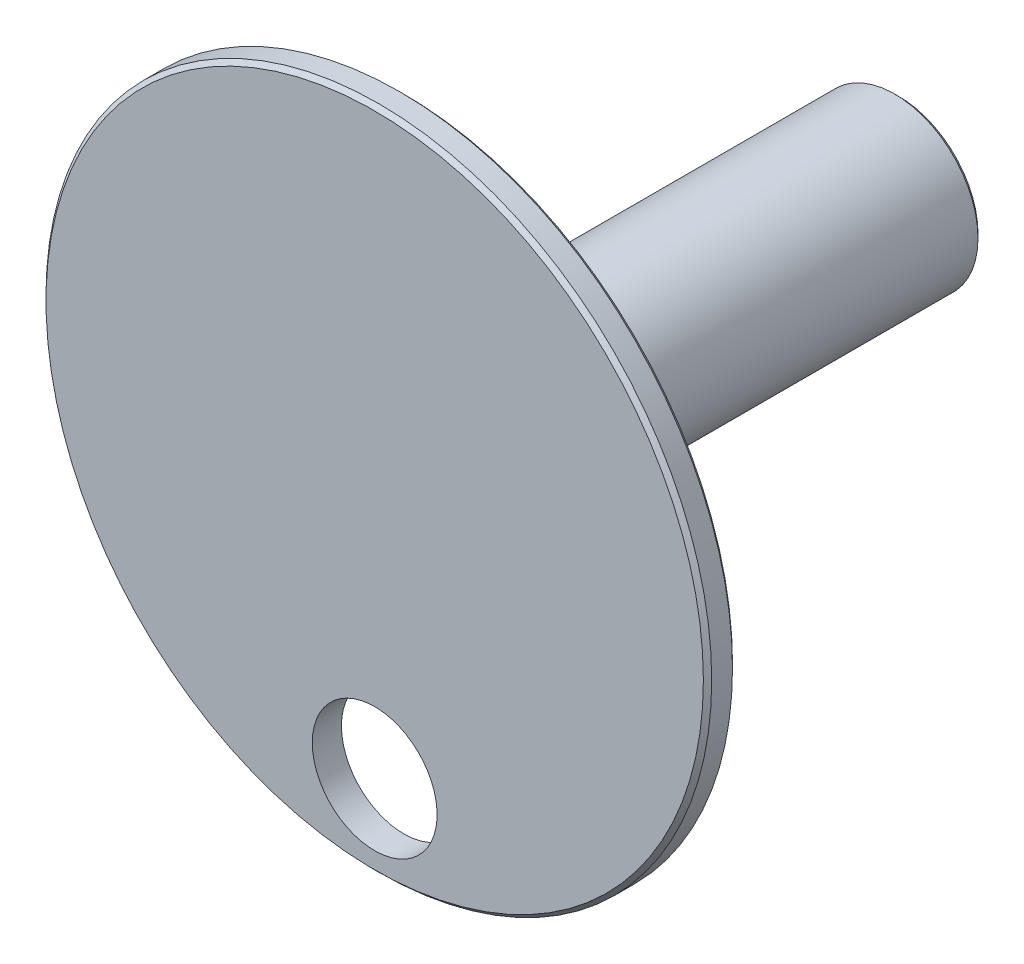
ISO-10303-21;
HEADER;
FILE_DESCRIPTION(('STEP AP214'),'2;1');
FILE_NAME('part.step','',(''),(''),'','','');
FILE_SCHEMA(('AUTOMOTIVE_DESIGN { 1 0 10303 214 1 1 1 1 }'));
ENDSEC;
DATA;
#1=APPLICATION_CONTEXT('core data for automotive mechanical design processes');
#2=APPLICATION_PROTOCOL_DEFINITION('international standard','automotive_design',2000,#1);
#3=PRODUCT_CONTEXT('',#1,'mechanical');
#4=PRODUCT('Part','Part','',(#3));
#5=PRODUCT_RELATED_PRODUCT_CATEGORY('part','',(#4));
#6=PRODUCT_DEFINITION_FORMATION('','',#4);
#7=PRODUCT_DEFINITION_CONTEXT('part definition',#1,'design');
#8=PRODUCT_DEFINITION('design','',#6,#7);
#9=PRODUCT_DEFINITION_SHAPE('','',#8);
#10=(LENGTH_UNIT() NAMED_UNIT(*) SI_UNIT(.MILLI.,.METRE.));
#11=(NAMED_UNIT(*) PLANE_ANGLE_UNIT() SI_UNIT($,.RADIAN.));
#12=(NAMED_UNIT(*) SI_UNIT($,.STERADIAN.) SOLID_ANGLE_UNIT());
#13=UNCERTAINTY_MEASURE_WITH_UNIT(LENGTH_MEASURE(1.E-05),#10,'distance_accuracy_value','');
#14=(GEOMETRIC_REPRESENTATION_CONTEXT(3) GLOBAL_UNCERTAINTY_ASSIGNED_CONTEXT((#13)) GLOBAL_UNIT_ASSIGNED_CONTEXT((#10,
#11,#12)) REPRESENTATION_CONTEXT('',''));
#15=CARTESIAN_POINT('',(0.,0.,0.));
#16=DIRECTION('',(0.,0.,1.));
#17=DIRECTION('',(1.,0.,0.));
#18=AXIS2_PLACEMENT_3D('',#15,#16,#17);
#19=CARTESIAN_POINT('',(0.,0.,11.6));
#20=DIRECTION('',(0.,0.,-1.));
#21=DIRECTION('',(-1.,0.,0.));
#22=AXIS2_PLACEMENT_3D('',#19,#20,#21);
#23=CYLINDRICAL_SURFACE('',#22,2.);
#24=CARTESIAN_POINT('',(0.,0.,0.0999999999999959));
#25=DIRECTION('',(0.,0.,1.));
#26=DIRECTION('',(1.,0.,0.));
#27=AXIS2_PLACEMENT_3D('',#24,#25,#26);
#28=CIRCLE('',#27,2.);
#29=CARTESIAN_POINT('',(2.,0.,0.0999999999999959));
#30=VERTEX_POINT('',#29);
#31=EDGE_CURVE('E57',#30,#30,#28,.T.);
#32=ORIENTED_EDGE('',*,*,#31,.T.);
#33=EDGE_LOOP('',(#32));
#34=FACE_BOUND('',#33,.T.);
#35=CARTESIAN_POINT('',(0.,0.,11.6));
#36=DIRECTION('',(0.,0.,1.));
#37=DIRECTION('',(1.,0.,0.));
#38=AXIS2_PLACEMENT_3D('',#35,#36,#37);
#39=CIRCLE('',#38,2.);
#40=CARTESIAN_POINT('',(2.,0.,11.6));
#41=VERTEX_POINT('',#40);
#42=EDGE_CURVE('E60',#41,#41,#39,.T.);
#43=ORIENTED_EDGE('',*,*,#42,.F.);
#44=EDGE_LOOP('',(#43));
#45=FACE_BOUND('',#44,.T.);
#46=ADVANCED_FACE('F33',(#34,#45),#23,.T.);
#47=CARTESIAN_POINT('',(0.,0.,0.));
#48=DIRECTION('',(0.,0.,1.));
#49=DIRECTION('',(1.,0.,0.));
#50=AXIS2_PLACEMENT_3D('',#47,#48,#49);
#51=PLANE('',#50);
#52=CARTESIAN_POINT('',(0.,0.,0.));
#53=DIRECTION('',(0.,0.,1.));
#54=DIRECTION('',(1.,0.,0.));
#55=AXIS2_PLACEMENT_3D('',#52,#53,#54);
#56=CIRCLE('',#55,1.9);
#57=CARTESIAN_POINT('',(1.9,0.,0.));
#58=VERTEX_POINT('',#57);
#59=EDGE_CURVE('E54',#58,#58,#56,.F.);
#60=ORIENTED_EDGE('',*,*,#59,.T.);
#61=EDGE_LOOP('',(#60));
#62=FACE_BOUND('',#61,.T.);
#63=CARTESIAN_POINT('',(0.,0.,0.));
#64=DIRECTION('',(0.,0.,-1.));
#65=DIRECTION('',(-1.,0.,0.));
#66=AXIS2_PLACEMENT_3D('',#63,#64,#65);
#67=CIRCLE('',#66,1.5);
#68=CARTESIAN_POINT('',(-1.5,0.,0.));
#69=VERTEX_POINT('',#68);
#70=EDGE_CURVE('E70',#69,#69,#67,.T.);
#71=ORIENTED_EDGE('',*,*,#70,.F.);
#72=EDGE_LOOP('',(#71));
#73=FACE_BOUND('',#72,.T.);
#74=ADVANCED_FACE('F103',(#62,#73),#51,.F.);
#75=CARTESIAN_POINT('',(0.,0.,11.9));
#76=DIRECTION('',(0.,0.,-1.));
#77=DIRECTION('',(-1.,0.,0.));
#78=AXIS2_PLACEMENT_3D('',#75,#76,#77);
#79=CYLINDRICAL_SURFACE('',#78,4.);
#80=CARTESIAN_POINT('',(0.,0.,11.9));
#81=DIRECTION('',(0.,0.,1.));
#82=DIRECTION('',(1.,0.,0.));
#83=AXIS2_PLACEMENT_3D('',#80,#81,#82);
#84=CIRCLE('',#83,4.);
#85=CARTESIAN_POINT('',(4.,0.,11.9));
#86=VERTEX_POINT('',#85);
#87=EDGE_CURVE('E63',#86,#86,#84,.T.);
#88=ORIENTED_EDGE('',*,*,#87,.F.);
#89=EDGE_LOOP('',(#88));
#90=FACE_BOUND('',#89,.T.);
#91=CARTESIAN_POINT('',(0.,0.,11.6));
#92=DIRECTION('',(0.,0.,1.));
#93=DIRECTION('',(1.,0.,0.));
#94=AXIS2_PLACEMENT_3D('',#91,#92,#93);
#95=CIRCLE('',#94,4.);
#96=CARTESIAN_POINT('',(4.,0.,11.6));
#97=VERTEX_POINT('',#96);
#98=EDGE_CURVE('E64',#97,#97,#95,.T.);
#99=ORIENTED_EDGE('',*,*,#98,.T.);
#100=EDGE_LOOP('',(#99));
#101=FACE_BOUND('',#100,.T.);
#102=ADVANCED_FACE('F99',(#90,#101),#79,.T.);
#103=CARTESIAN_POINT('',(0.,0.,11.6));
#104=DIRECTION('',(0.,0.,1.));
#105=DIRECTION('',(1.,0.,0.));
#106=AXIS2_PLACEMENT_3D('',#103,#104,#105);
#107=PLANE('',#106);
#108=ORIENTED_EDGE('',*,*,#42,.T.);
#109=EDGE_LOOP('',(#108));
#110=FACE_BOUND('',#109,.T.);
#111=ORIENTED_EDGE('',*,*,#98,.F.);
#112=EDGE_LOOP('',(#111));
#113=FACE_BOUND('',#112,.T.);
#114=ADVANCED_FACE('F102',(#110,#113),#107,.F.);
#115=CARTESIAN_POINT('',(0.,0.,12.6));
#116=DIRECTION('',(0.,0.,-1.));
#117=DIRECTION('',(-1.,0.,0.));
#118=AXIS2_PLACEMENT_3D('',#115,#116,#117);
#119=CYLINDRICAL_SURFACE('',#118,8.);
#120=CARTESIAN_POINT('',(0.,0.,12.));
#121=DIRECTION('',(0.,0.,1.));
#122=DIRECTION('',(1.,0.,0.));
#123=AXIS2_PLACEMENT_3D('',#120,#121,#122);
#124=CIRCLE('',#123,8.);
#125=CARTESIAN_POINT('',(8.,0.,12.));
#126=VERTEX_POINT('',#125);
#127=EDGE_CURVE('E45',#126,#126,#124,.T.);
#128=ORIENTED_EDGE('',*,*,#127,.T.);
#129=EDGE_LOOP('',(#128));
#130=FACE_BOUND('',#129,.T.);
#131=CARTESIAN_POINT('',(0.,0.,12.5));
#132=DIRECTION('',(0.,0.,1.));
#133=DIRECTION('',(1.,0.,0.));
#134=AXIS2_PLACEMENT_3D('',#131,#132,#133);
#135=CIRCLE('',#134,8.);
#136=CARTESIAN_POINT('',(8.,0.,12.5));
#137=VERTEX_POINT('',#136);
#138=EDGE_CURVE('E49',#137,#137,#135,.F.);
#139=ORIENTED_EDGE('',*,*,#138,.T.);
#140=EDGE_LOOP('',(#139));
#141=FACE_BOUND('',#140,.T.);
#142=ADVANCED_FACE('F108',(#130,#141),#119,.T.);
#143=CARTESIAN_POINT('',(0.,0.,12.6));
#144=DIRECTION('',(0.,0.,1.));
#145=DIRECTION('',(1.,0.,0.));
#146=AXIS2_PLACEMENT_3D('',#143,#144,#145);
#147=PLANE('',#146);
#148=CARTESIAN_POINT('',(0.,0.,12.6));
#149=DIRECTION('',(0.,0.,1.));
#150=DIRECTION('',(1.,0.,0.));
#151=AXIS2_PLACEMENT_3D('',#148,#149,#150);
#152=CIRCLE('',#151,7.9);
#153=CARTESIAN_POINT('',(7.9,0.,12.6));
#154=VERTEX_POINT('',#153);
#155=EDGE_CURVE('E10',#154,#154,#152,.T.);
#156=ORIENTED_EDGE('',*,*,#155,.T.);
#157=EDGE_LOOP('',(#156));
#158=FACE_BOUND('',#157,.T.);
#159=CARTESIAN_POINT('',(0.,-6.,12.6));
#160=DIRECTION('',(0.,0.,-1.));
#161=DIRECTION('',(-1.,0.,0.));
#162=AXIS2_PLACEMENT_3D('',#159,#160,#161);
#163=CIRCLE('',#162,1.5);
#164=CARTESIAN_POINT('',(-1.5,-6.,12.6));
#165=VERTEX_POINT('',#164);
#166=EDGE_CURVE('E73',#165,#165,#163,.T.);
#167=ORIENTED_EDGE('',*,*,#166,.T.);
#168=EDGE_LOOP('',(#167));
#169=FACE_BOUND('',#168,.T.);
#170=ADVANCED_FACE('F82',(#158,#169),#147,.T.);
#171=CARTESIAN_POINT('',(0.,0.,11.9));
#172=DIRECTION('',(0.,0.,1.));
#173=DIRECTION('',(1.,0.,0.));
#174=AXIS2_PLACEMENT_3D('',#171,#172,#173);
#175=PLANE('',#174);
#176=CARTESIAN_POINT('',(0.,0.,11.9));
#177=DIRECTION('',(0.,0.,1.));
#178=DIRECTION('',(1.,0.,0.));
#179=AXIS2_PLACEMENT_3D('',#176,#177,#178);
#180=CIRCLE('',#179,7.90000000000001);
#181=CARTESIAN_POINT('',(7.90000000000001,0.,11.9));
#182=VERTEX_POINT('',#181);
#183=EDGE_CURVE('E41',#182,#182,#180,.F.);
#184=ORIENTED_EDGE('',*,*,#183,.T.);
#185=EDGE_LOOP('',(#184));
#186=FACE_BOUND('',#185,.T.);
#187=CARTESIAN_POINT('',(0.,-6.,11.9));
#188=DIRECTION('',(0.,0.,-1.));
#189=DIRECTION('',(-1.,0.,0.));
#190=AXIS2_PLACEMENT_3D('',#187,#188,#189);
#191=CIRCLE('',#190,1.5);
#192=CARTESIAN_POINT('',(-1.5,-6.,11.9));
#193=VERTEX_POINT('',#192);
#194=EDGE_CURVE('E76',#193,#193,#191,.T.);
#195=ORIENTED_EDGE('',*,*,#194,.F.);
#196=EDGE_LOOP('',(#195));
#197=FACE_BOUND('',#196,.T.);
#198=ORIENTED_EDGE('',*,*,#87,.T.);
#199=EDGE_LOOP('',(#198));
#200=FACE_BOUND('',#199,.T.);
#201=ADVANCED_FACE('F92',(#186,#197,#200),#175,.F.);
#202=CARTESIAN_POINT('',(0.,0.,8.5));
#203=DIRECTION('',(0.,0.,-1.));
#204=DIRECTION('',(-1.,0.,0.));
#205=AXIS2_PLACEMENT_3D('',#202,#203,#204);
#206=CYLINDRICAL_SURFACE('',#205,1.5);
#207=CARTESIAN_POINT('',(0.,0.,8.5));
#208=DIRECTION('',(0.,0.,-1.));
#209=DIRECTION('',(-1.,0.,0.));
#210=AXIS2_PLACEMENT_3D('',#207,#208,#209);
#211=CIRCLE('',#210,1.5);
#212=CARTESIAN_POINT('',(-1.5,0.,8.5));
#213=VERTEX_POINT('',#212);
#214=EDGE_CURVE('E67',#213,#213,#211,.T.);
#215=ORIENTED_EDGE('',*,*,#214,.F.);
#216=EDGE_LOOP('',(#215));
#217=FACE_BOUND('',#216,.T.);
#218=ORIENTED_EDGE('',*,*,#70,.T.);
#219=EDGE_LOOP('',(#218));
#220=FACE_BOUND('',#219,.T.);
#221=ADVANCED_FACE('F95',(#217,#220),#206,.F.);
#222=CARTESIAN_POINT('',(0.,0.,8.5));
#223=DIRECTION('',(0.,0.,-1.));
#224=DIRECTION('',(-1.,0.,0.));
#225=AXIS2_PLACEMENT_3D('',#222,#223,#224);
#226=PLANE('',#225);
#227=ORIENTED_EDGE('',*,*,#214,.T.);
#228=EDGE_LOOP('',(#227));
#229=FACE_BOUND('',#228,.T.);
#230=ADVANCED_FACE('F88',(#229),#226,.T.);
#231=CARTESIAN_POINT('',(0.,-6.,12.6));
#232=DIRECTION('',(0.,0.,-1.));
#233=DIRECTION('',(-1.,0.,0.));
#234=AXIS2_PLACEMENT_3D('',#231,#232,#233);
#235=CYLINDRICAL_SURFACE('',#234,1.5);
#236=CARTESIAN_POINT('',(-1.5,-6.,12.6));
#237=CARTESIAN_POINT('',(-1.5,-6.,12.5927083333333));
#238=CARTESIAN_POINT('',(-1.5,-6.,12.5854166666667));
#239=CARTESIAN_POINT('',(-1.5,-6.,12.5708333333333));
#240=CARTESIAN_POINT('',(-1.5,-6.,12.5635416666667));
#241=CARTESIAN_POINT('',(-1.5,-6.,12.5489583333333));
#242=CARTESIAN_POINT('',(-1.5,-6.,12.5416666666667));
#243=CARTESIAN_POINT('',(-1.5,-6.,12.5270833333333));
#244=CARTESIAN_POINT('',(-1.5,-6.,12.5197916666667));
#245=CARTESIAN_POINT('',(-1.5,-6.,12.5052083333333));
#246=CARTESIAN_POINT('',(-1.5,-6.,12.4979166666667));
#247=CARTESIAN_POINT('',(-1.5,-6.,12.4833333333333));
#248=CARTESIAN_POINT('',(-1.5,-6.,12.4760416666667));
#249=CARTESIAN_POINT('',(-1.5,-6.,12.4614583333333));
#250=CARTESIAN_POINT('',(-1.5,-6.,12.4541666666667));
#251=CARTESIAN_POINT('',(-1.5,-6.,12.4395833333333));
#252=CARTESIAN_POINT('',(-1.5,-6.,12.4322916666667));
#253=CARTESIAN_POINT('',(-1.5,-6.,12.4177083333333));
#254=CARTESIAN_POINT('',(-1.5,-6.,12.4104166666667));
#255=CARTESIAN_POINT('',(-1.5,-6.,12.3958333333333));
#256=CARTESIAN_POINT('',(-1.5,-6.,12.3885416666667));
#257=CARTESIAN_POINT('',(-1.5,-6.,12.3739583333333));
#258=CARTESIAN_POINT('',(-1.5,-6.,12.3666666666667));
#259=CARTESIAN_POINT('',(-1.5,-6.,12.3520833333333));
#260=CARTESIAN_POINT('',(-1.5,-6.,12.3447916666667));
#261=CARTESIAN_POINT('',(-1.5,-6.,12.3302083333333));
#262=CARTESIAN_POINT('',(-1.5,-6.,12.3229166666667));
#263=CARTESIAN_POINT('',(-1.5,-6.,12.3083333333333));
#264=CARTESIAN_POINT('',(-1.5,-6.,12.3010416666667));
#265=CARTESIAN_POINT('',(-1.5,-6.,12.2864583333333));
#266=CARTESIAN_POINT('',(-1.5,-6.,12.2791666666667));
#267=CARTESIAN_POINT('',(-1.5,-6.,12.2645833333333));
#268=CARTESIAN_POINT('',(-1.5,-6.,12.2572916666667));
#269=CARTESIAN_POINT('',(-1.5,-6.,12.2427083333333));
#270=CARTESIAN_POINT('',(-1.5,-6.,12.2354166666667));
#271=CARTESIAN_POINT('',(-1.5,-6.,12.2208333333333));
#272=CARTESIAN_POINT('',(-1.5,-6.,12.2135416666667));
#273=CARTESIAN_POINT('',(-1.5,-6.,12.1989583333333));
#274=CARTESIAN_POINT('',(-1.5,-6.,12.1916666666667));
#275=CARTESIAN_POINT('',(-1.5,-6.,12.1770833333333));
#276=CARTESIAN_POINT('',(-1.5,-6.,12.1697916666667));
#277=CARTESIAN_POINT('',(-1.5,-6.,12.1552083333333));
#278=CARTESIAN_POINT('',(-1.5,-6.,12.1479166666667));
#279=CARTESIAN_POINT('',(-1.5,-6.,12.1333333333333));
#280=CARTESIAN_POINT('',(-1.5,-6.,12.1260416666667));
#281=CARTESIAN_POINT('',(-1.5,-6.,12.1114583333333));
#282=CARTESIAN_POINT('',(-1.5,-6.,12.1041666666667));
#283=CARTESIAN_POINT('',(-1.5,-6.,12.0895833333333));
#284=CARTESIAN_POINT('',(-1.5,-6.,12.0822916666667));
#285=CARTESIAN_POINT('',(-1.5,-6.,12.0677083333333));
#286=CARTESIAN_POINT('',(-1.5,-6.,12.0604166666667));
#287=CARTESIAN_POINT('',(-1.5,-6.,12.0458333333333));
#288=CARTESIAN_POINT('',(-1.5,-6.,12.0385416666667));
#289=CARTESIAN_POINT('',(-1.5,-6.,12.0239583333333));
#290=CARTESIAN_POINT('',(-1.5,-6.,12.0166666666667));
#291=CARTESIAN_POINT('',(-1.5,-6.,12.0020833333333));
#292=CARTESIAN_POINT('',(-1.5,-6.,11.9947916666667));
#293=CARTESIAN_POINT('',(-1.5,-6.,11.9802083333333));
#294=CARTESIAN_POINT('',(-1.5,-6.,11.9729166666667));
#295=CARTESIAN_POINT('',(-1.5,-6.,11.9583333333333));
#296=CARTESIAN_POINT('',(-1.5,-6.,11.9510416666667));
#297=CARTESIAN_POINT('',(-1.5,-6.,11.9364583333333));
#298=CARTESIAN_POINT('',(-1.5,-6.,11.9291666666667));
#299=CARTESIAN_POINT('',(-1.5,-6.,11.9145833333333));
#300=CARTESIAN_POINT('',(-1.5,-6.,11.9072916666667));
#301=CARTESIAN_POINT('',(-1.5,-6.,11.9));
#302=B_SPLINE_CURVE_WITH_KNOTS('',3,(#236,#237,#238,#239,#240,#241,#242,#243,#244,#245,#246,
#247,#248,#249,#250,#251,#252,#253,#254,#255,#256,#257,#258,#259,#260,#261,#262,#263,#264,#265,
#266,#267,#268,#269,#270,#271,#272,#273,#274,#275,#276,#277,#278,#279,#280,#281,#282,#283,#284,
#285,#286,#287,#288,#289,#290,#291,#292,#293,#294,#295,#296,#297,#298,#299,#300,#301),
.UNSPECIFIED.,.F.,.F.,(4,2,2,2,2,2,2,2,2,2,2,2,2,2,2,2,2,2,2,2,2,2,2,2,2,2,2,2,2,2,2,2,4),(0.,
0.0218750000000011,0.0437500000000004,0.0656250000000014,0.0875000000000008,0.109375,
0.131250000000001,0.153125,0.175000000000002,0.196875000000001,0.21875,0.240625000000001,
0.262500000000001,0.284375,0.306250000000001,0.328125,0.350000000000001,0.371875000000001,
0.39375,0.415625000000001,0.4375,0.459375,0.481250000000001,0.503125,0.525000000000001,0.546875,
0.56875,0.590625000000001,0.6125,0.634374999999999,0.656250000000001,0.678125,
0.700000000000001),.UNSPECIFIED.);
#303=EDGE_CURVE('BSEAM84',#165,#193,#302,.T.);
#304=ORIENTED_EDGE('',*,*,#166,.F.);
#305=ORIENTED_EDGE('',*,*,#194,.T.);
#306=ORIENTED_EDGE('',*,*,#303,.T.);
#307=ORIENTED_EDGE('',*,*,#303,.F.);
#308=EDGE_LOOP('',(#304,#306,#305,#307));
#309=FACE_BOUND('',#308,.T.);
#310=ADVANCED_FACE('F84',(#309),#235,.F.);
#311=CARTESIAN_POINT('',(0.,0.,0.0999999999999959));
#312=DIRECTION('',(0.,0.,1.));
#313=DIRECTION('',(1.,0.,0.));
#314=AXIS2_PLACEMENT_3D('',#311,#312,#313);
#315=CONICAL_SURFACE('',#314,2.,0.785398163397466);
#316=ORIENTED_EDGE('',*,*,#59,.F.);
#317=EDGE_LOOP('',(#316));
#318=FACE_BOUND('',#317,.T.);
#319=ORIENTED_EDGE('',*,*,#31,.F.);
#320=EDGE_LOOP('',(#319));
#321=FACE_BOUND('',#320,.T.);
#322=ADVANCED_FACE('F87',(#318,#321),#315,.T.);
#323=CARTESIAN_POINT('',(0.,0.,12.));
#324=DIRECTION('',(0.,0.,1.));
#325=DIRECTION('',(1.,0.,0.));
#326=AXIS2_PLACEMENT_3D('',#323,#324,#325);
#327=CONICAL_SURFACE('',#326,8.,0.78539816339744);
#328=CARTESIAN_POINT('',(7.90000000000001,0.,11.9));
#329=CARTESIAN_POINT('',(7.90104166666667,0.,11.9010416666667));
#330=CARTESIAN_POINT('',(7.90208333333334,0.,11.9020833333333));
#331=CARTESIAN_POINT('',(7.90416666666667,0.,11.9041666666667));
#332=CARTESIAN_POINT('',(7.90520833333334,0.,11.9052083333333));
#333=CARTESIAN_POINT('',(7.90729166666667,0.,11.9072916666667));
#334=CARTESIAN_POINT('',(7.90833333333334,0.,11.9083333333333));
#335=CARTESIAN_POINT('',(7.91041666666667,0.,11.9104166666667));
#336=CARTESIAN_POINT('',(7.91145833333334,0.,11.9114583333333));
#337=CARTESIAN_POINT('',(7.91354166666667,0.,11.9135416666667));
#338=CARTESIAN_POINT('',(7.91458333333334,0.,11.9145833333333));
#339=CARTESIAN_POINT('',(7.91666666666667,0.,11.9166666666667));
#340=CARTESIAN_POINT('',(7.91770833333334,0.,11.9177083333333));
#341=CARTESIAN_POINT('',(7.91979166666667,0.,11.9197916666667));
#342=CARTESIAN_POINT('',(7.92083333333334,0.,11.9208333333333));
#343=CARTESIAN_POINT('',(7.92291666666667,0.,11.9229166666667));
#344=CARTESIAN_POINT('',(7.92395833333334,0.,11.9239583333333));
#345=CARTESIAN_POINT('',(7.92604166666667,0.,11.9260416666667));
#346=CARTESIAN_POINT('',(7.92708333333334,0.,11.9270833333333));
#347=CARTESIAN_POINT('',(7.92916666666667,0.,11.9291666666667));
#348=CARTESIAN_POINT('',(7.93020833333334,0.,11.9302083333333));
#349=CARTESIAN_POINT('',(7.93229166666667,0.,11.9322916666667));
#350=CARTESIAN_POINT('',(7.93333333333334,0.,11.9333333333333));
#351=CARTESIAN_POINT('',(7.93541666666667,0.,11.9354166666667));
#352=CARTESIAN_POINT('',(7.93645833333334,0.,11.9364583333333));
#353=CARTESIAN_POINT('',(7.93854166666667,0.,11.9385416666667));
#354=CARTESIAN_POINT('',(7.93958333333334,0.,11.9395833333333));
#355=CARTESIAN_POINT('',(7.94166666666667,0.,11.9416666666667));
#356=CARTESIAN_POINT('',(7.94270833333334,0.,11.9427083333333));
#357=CARTESIAN_POINT('',(7.94479166666667,0.,11.9447916666667));
#358=CARTESIAN_POINT('',(7.94583333333334,0.,11.9458333333333));
#359=CARTESIAN_POINT('',(7.94791666666667,0.,11.9479166666667));
#360=CARTESIAN_POINT('',(7.94895833333334,0.,11.9489583333333));
#361=CARTESIAN_POINT('',(7.95104166666667,0.,11.9510416666667));
#362=CARTESIAN_POINT('',(7.95208333333334,0.,11.9520833333333));
#363=CARTESIAN_POINT('',(7.95416666666667,0.,11.9541666666667));
#364=CARTESIAN_POINT('',(7.95520833333334,0.,11.9552083333333));
#365=CARTESIAN_POINT('',(7.95729166666667,0.,11.9572916666667));
#366=CARTESIAN_POINT('',(7.95833333333334,0.,11.9583333333333));
#367=CARTESIAN_POINT('',(7.96041666666667,0.,11.9604166666667));
#368=CARTESIAN_POINT('',(7.96145833333334,0.,11.9614583333333));
#369=CARTESIAN_POINT('',(7.96354166666667,0.,11.9635416666667));
#370=CARTESIAN_POINT('',(7.96458333333334,0.,11.9645833333333));
#371=CARTESIAN_POINT('',(7.96666666666667,0.,11.9666666666667));
#372=CARTESIAN_POINT('',(7.96770833333334,0.,11.9677083333333));
#373=CARTESIAN_POINT('',(7.96979166666667,0.,11.9697916666667));
#374=CARTESIAN_POINT('',(7.97083333333333,0.,11.9708333333333));
#375=CARTESIAN_POINT('',(7.97291666666667,0.,11.9729166666667));
#376=CARTESIAN_POINT('',(7.97395833333333,0.,11.9739583333333));
#377=CARTESIAN_POINT('',(7.97604166666667,0.,11.9760416666667));
#378=CARTESIAN_POINT('',(7.97708333333333,0.,11.9770833333333));
#379=CARTESIAN_POINT('',(7.97916666666667,0.,11.9791666666667));
#380=CARTESIAN_POINT('',(7.98020833333333,0.,11.9802083333333));
#381=CARTESIAN_POINT('',(7.98229166666667,0.,11.9822916666667));
#382=CARTESIAN_POINT('',(7.98333333333333,0.,11.9833333333333));
#383=CARTESIAN_POINT('',(7.98541666666667,0.,11.9854166666667));
#384=CARTESIAN_POINT('',(7.98645833333333,0.,11.9864583333333));
#385=CARTESIAN_POINT('',(7.98854166666667,0.,11.9885416666667));
#386=CARTESIAN_POINT('',(7.98958333333333,0.,11.9895833333333));
#387=CARTESIAN_POINT('',(7.99166666666667,0.,11.9916666666667));
#388=CARTESIAN_POINT('',(7.99270833333333,0.,11.9927083333333));
#389=CARTESIAN_POINT('',(7.99479166666667,0.,11.9947916666667));
#390=CARTESIAN_POINT('',(7.99583333333333,0.,11.9958333333333));
#391=CARTESIAN_POINT('',(7.99791666666667,0.,11.9979166666667));
#392=CARTESIAN_POINT('',(7.99895833333333,0.,11.9989583333333));
#393=CARTESIAN_POINT('',(8.,0.,12.));
#394=B_SPLINE_CURVE_WITH_KNOTS('',3,(#328,#329,#330,#331,#332,#333,#334,#335,#336,#337,#338,
#339,#340,#341,#342,#343,#344,#345,#346,#347,#348,#349,#350,#351,#352,#353,#354,#355,#356,#357,
#358,#359,#360,#361,#362,#363,#364,#365,#366,#367,#368,#369,#370,#371,#372,#373,#374,#375,#376,
#377,#378,#379,#380,#381,#382,#383,#384,#385,#386,#387,#388,#389,#390,#391,#392,#393),
.UNSPECIFIED.,.F.,.F.,(4,2,2,2,2,2,2,2,2,2,2,2,2,2,2,2,2,2,2,2,2,2,2,2,2,2,2,2,2,2,2,2,4),(0.,
0.00441941738241544,0.00883883476483087,0.0132582521472463,0.0176776695296617,
0.0220970869120772,0.0265165042944926,0.030935921676908,0.0353553390593235,0.0397747564417389,
0.0441941738241543,0.048613591206571,0.0530330085889864,0.0574524259714019,0.0618718433538173,
0.0662912607362327,0.0707106781186482,0.0751300955010648,0.0795495128834803,0.0839689302658957,
0.0883883476483112,0.0928077650307266,0.0972271824131433,0.101646599795559,0.106066017177974,
0.11048543456039,0.114904851942805,0.11932426932522,0.123743686707636,0.128163104090051,
0.132582521472467,0.137001938854882,0.1414213562373),.UNSPECIFIED.);
#395=EDGE_CURVE('BSEAM131',#182,#126,#394,.T.);
#396=ORIENTED_EDGE('',*,*,#183,.F.);
#397=ORIENTED_EDGE('',*,*,#127,.F.);
#398=ORIENTED_EDGE('',*,*,#395,.T.);
#399=ORIENTED_EDGE('',*,*,#395,.F.);
#400=EDGE_LOOP('',(#396,#398,#397,#399));
#401=FACE_BOUND('',#400,.T.);
#402=ADVANCED_FACE('F131',(#401),#327,.T.);
#403=CARTESIAN_POINT('',(0.,0.,12.6));
#404=DIRECTION('',(0.,0.,-1.));
#405=DIRECTION('',(-1.,0.,0.));
#406=AXIS2_PLACEMENT_3D('',#403,#404,#405);
#407=CONICAL_SURFACE('',#406,7.9,0.78539816339744);
#408=ORIENTED_EDGE('',*,*,#138,.F.);
#409=EDGE_LOOP('',(#408));
#410=FACE_BOUND('',#409,.T.);
#411=ORIENTED_EDGE('',*,*,#155,.F.);
#412=EDGE_LOOP('',(#411));
#413=FACE_BOUND('',#412,.T.);
#414=ADVANCED_FACE('F36',(#410,#413),#407,.T.);
#415=CLOSED_SHELL('',(#46,#74,#102,#114,#142,#170,#201,#221,#230,#310,#322,#402,#414));
#416=MANIFOLD_SOLID_BREP('B2',#415);
#417=ADVANCED_BREP_SHAPE_REPRESENTATION('',(#18,#416),#14);
#418=SHAPE_DEFINITION_REPRESENTATION(#9,#417);
ENDSEC;
END-ISO-10303-21;
